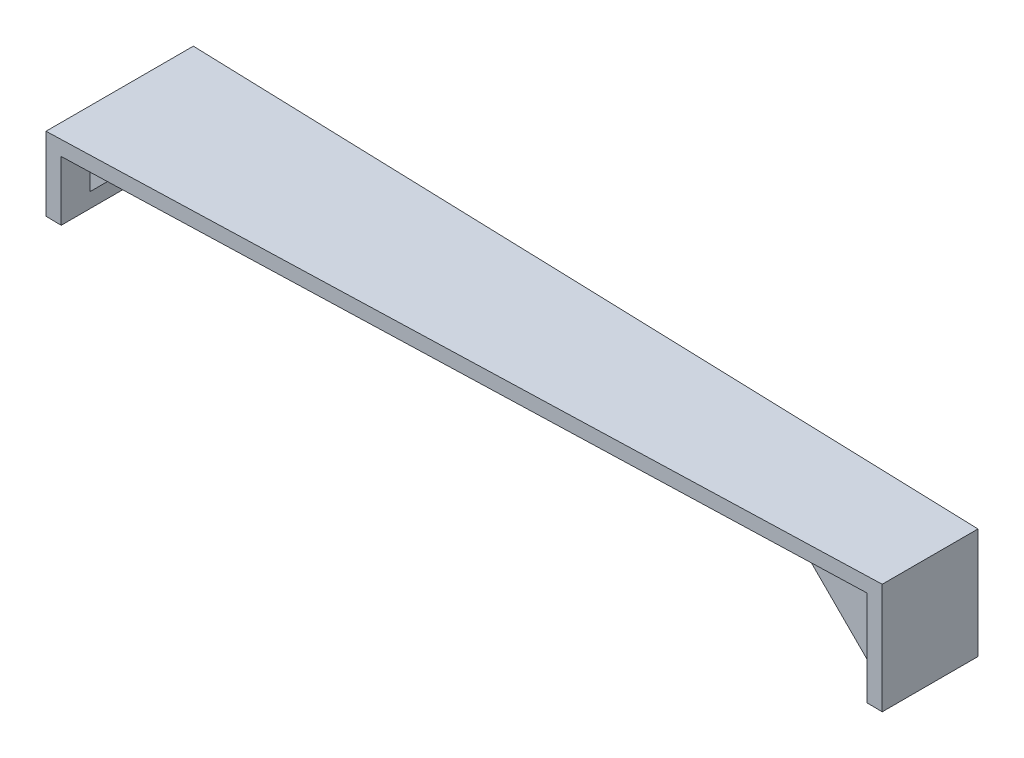
ISO-10303-21;
HEADER;
FILE_DESCRIPTION(('STEP AP214'),'2;1');
FILE_NAME('part.step','',(''),(''),'','','');
FILE_SCHEMA(('AUTOMOTIVE_DESIGN { 1 0 10303 214 1 1 1 1 }'));
ENDSEC;
DATA;
#1=APPLICATION_CONTEXT('core data for automotive mechanical design processes');
#2=APPLICATION_PROTOCOL_DEFINITION('international standard','automotive_design',2000,#1);
#3=PRODUCT_CONTEXT('',#1,'mechanical');
#4=PRODUCT('Part','Part','',(#3));
#5=PRODUCT_RELATED_PRODUCT_CATEGORY('part','',(#4));
#6=PRODUCT_DEFINITION_FORMATION('','',#4);
#7=PRODUCT_DEFINITION_CONTEXT('part definition',#1,'design');
#8=PRODUCT_DEFINITION('design','',#6,#7);
#9=PRODUCT_DEFINITION_SHAPE('','',#8);
#10=(LENGTH_UNIT() NAMED_UNIT(*) SI_UNIT(.MILLI.,.METRE.));
#11=(NAMED_UNIT(*) PLANE_ANGLE_UNIT() SI_UNIT($,.RADIAN.));
#12=(NAMED_UNIT(*) SI_UNIT($,.STERADIAN.) SOLID_ANGLE_UNIT());
#13=UNCERTAINTY_MEASURE_WITH_UNIT(LENGTH_MEASURE(1.E-05),#10,'distance_accuracy_value','');
#14=(GEOMETRIC_REPRESENTATION_CONTEXT(3) GLOBAL_UNCERTAINTY_ASSIGNED_CONTEXT((#13)) GLOBAL_UNIT_ASSIGNED_CONTEXT((#10,
#11,#12)) REPRESENTATION_CONTEXT('',''));
#15=CARTESIAN_POINT('',(0.,0.,0.));
#16=DIRECTION('',(0.,0.,1.));
#17=DIRECTION('',(1.,0.,0.));
#18=AXIS2_PLACEMENT_3D('',#15,#16,#17);
#19=CARTESIAN_POINT('',(0.,-2.,0.));
#20=DIRECTION('',(0.,1.,0.));
#21=DIRECTION('',(0.,0.,1.));
#22=AXIS2_PLACEMENT_3D('',#19,#20,#21);
#23=PLANE('',#22);
#24=DIRECTION('',(0.,0.,-1.));
#25=VECTOR('',#24,1.);
#26=CARTESIAN_POINT('',(53.,-2.,-6.56363636363636));
#27=LINE('',#26,#25);
#28=CARTESIAN_POINT('',(53.,-2.,-6.));
#29=VERTEX_POINT('',#28);
#30=CARTESIAN_POINT('',(53.,-2.,-6.56363636363636));
#31=VERTEX_POINT('',#30);
#32=EDGE_CURVE('E189',#29,#31,#27,.T.);
#33=ORIENTED_EDGE('',*,*,#32,.F.);
#34=DIRECTION('',(-1.,0.,0.));
#35=VECTOR('',#34,1.);
#36=CARTESIAN_POINT('',(53.,-2.,-6.));
#37=LINE('',#36,#35);
#38=CARTESIAN_POINT('',(44.090909090909,-2.,-6.));
#39=VERTEX_POINT('',#38);
#40=EDGE_CURVE('E59',#29,#39,#37,.T.);
#41=ORIENTED_EDGE('',*,*,#40,.T.);
#42=DIRECTION('',(0.,0.,1.));
#43=VECTOR('',#42,1.);
#44=CARTESIAN_POINT('',(44.090909090909,-2.,-6.));
#45=LINE('',#44,#43);
#46=CARTESIAN_POINT('',(44.090909090909,-2.,-4.));
#47=VERTEX_POINT('',#46);
#48=EDGE_CURVE('E63',#39,#47,#45,.T.);
#49=ORIENTED_EDGE('',*,*,#48,.T.);
#50=DIRECTION('',(-1.,0.,0.));
#51=VECTOR('',#50,1.);
#52=CARTESIAN_POINT('',(53.,-2.,-4.));
#53=LINE('',#52,#51);
#54=CARTESIAN_POINT('',(53.,-2.,-4.));
#55=VERTEX_POINT('',#54);
#56=EDGE_CURVE('E192',#55,#47,#53,.T.);
#57=ORIENTED_EDGE('',*,*,#56,.F.);
#58=CARTESIAN_POINT('',(53.,-2.,4.));
#59=VERTEX_POINT('',#58);
#60=EDGE_CURVE('E179',#59,#55,#27,.T.);
#61=ORIENTED_EDGE('',*,*,#60,.F.);
#62=DIRECTION('',(-1.,0.,0.));
#63=VECTOR('',#62,1.);
#64=CARTESIAN_POINT('',(53.,-2.,4.));
#65=LINE('',#64,#63);
#66=CARTESIAN_POINT('',(44.090909090909,-2.,4.));
#67=VERTEX_POINT('',#66);
#68=EDGE_CURVE('E248',#59,#67,#65,.T.);
#69=ORIENTED_EDGE('',*,*,#68,.T.);
#70=DIRECTION('',(0.,0.,-1.));
#71=VECTOR('',#70,1.);
#72=CARTESIAN_POINT('',(44.090909090909,-2.,6.));
#73=LINE('',#72,#71);
#74=CARTESIAN_POINT('',(44.090909090909,-2.,6.));
#75=VERTEX_POINT('',#74);
#76=EDGE_CURVE('E256',#75,#67,#73,.T.);
#77=ORIENTED_EDGE('',*,*,#76,.F.);
#78=DIRECTION('',(-1.,0.,0.));
#79=VECTOR('',#78,1.);
#80=CARTESIAN_POINT('',(53.,-2.,6.));
#81=LINE('',#80,#79);
#82=CARTESIAN_POINT('',(53.,-2.,6.));
#83=VERTEX_POINT('',#82);
#84=EDGE_CURVE('E252',#83,#75,#81,.T.);
#85=ORIENTED_EDGE('',*,*,#84,.F.);
#86=CARTESIAN_POINT('',(53.,-2.,6.56363636363636));
#87=VERTEX_POINT('',#86);
#88=EDGE_CURVE('E188',#87,#83,#27,.T.);
#89=ORIENTED_EDGE('',*,*,#88,.F.);
#90=DIRECTION('',(0.999494185684063,0.,-0.0318020877263111));
#91=VECTOR('',#90,1.);
#92=CARTESIAN_POINT('',(55.,-2.,6.5));
#93=LINE('',#92,#91);
#94=CARTESIAN_POINT('',(-53.,-2.,9.93636363636364));
#95=VERTEX_POINT('',#94);
#96=EDGE_CURVE('E345',#95,#87,#93,.T.);
#97=ORIENTED_EDGE('',*,*,#96,.F.);
#98=DIRECTION('',(0.,0.,1.));
#99=VECTOR('',#98,1.);
#100=CARTESIAN_POINT('',(-53.,-2.,9.93636363636364));
#101=LINE('',#100,#99);
#102=CARTESIAN_POINT('',(-53.,-2.,6.));
#103=VERTEX_POINT('',#102);
#104=EDGE_CURVE('E321',#103,#95,#101,.T.);
#105=ORIENTED_EDGE('',*,*,#104,.F.);
#106=DIRECTION('',(-1.,0.,0.));
#107=VECTOR('',#106,1.);
#108=CARTESIAN_POINT('',(-46.9090909090908,-2.,6.));
#109=LINE('',#108,#107);
#110=CARTESIAN_POINT('',(-46.9090909090908,-2.,6.));
#111=VERTEX_POINT('',#110);
#112=EDGE_CURVE('E279',#111,#103,#109,.T.);
#113=ORIENTED_EDGE('',*,*,#112,.F.);
#114=DIRECTION('',(0.,0.,-1.));
#115=VECTOR('',#114,1.);
#116=CARTESIAN_POINT('',(-46.9090909090908,-2.,6.));
#117=LINE('',#116,#115);
#118=CARTESIAN_POINT('',(-46.9090909090908,-2.,4.));
#119=VERTEX_POINT('',#118);
#120=EDGE_CURVE('E282',#111,#119,#117,.T.);
#121=ORIENTED_EDGE('',*,*,#120,.T.);
#122=DIRECTION('',(-1.,0.,0.));
#123=VECTOR('',#122,1.);
#124=CARTESIAN_POINT('',(-46.9090909090908,-2.,4.));
#125=LINE('',#124,#123);
#126=CARTESIAN_POINT('',(-53.,-2.,4.));
#127=VERTEX_POINT('',#126);
#128=EDGE_CURVE('E276',#119,#127,#125,.T.);
#129=ORIENTED_EDGE('',*,*,#128,.T.);
#130=CARTESIAN_POINT('',(-53.,-2.,-4.));
#131=VERTEX_POINT('',#130);
#132=EDGE_CURVE('E337',#131,#127,#101,.T.);
#133=ORIENTED_EDGE('',*,*,#132,.F.);
#134=DIRECTION('',(-1.,0.,0.));
#135=VECTOR('',#134,1.);
#136=CARTESIAN_POINT('',(-46.9090909090908,-2.,-4.));
#137=LINE('',#136,#135);
#138=CARTESIAN_POINT('',(-46.9090909090908,-2.,-4.));
#139=VERTEX_POINT('',#138);
#140=EDGE_CURVE('E230',#139,#131,#137,.T.);
#141=ORIENTED_EDGE('',*,*,#140,.F.);
#142=DIRECTION('',(0.,0.,1.));
#143=VECTOR('',#142,1.);
#144=CARTESIAN_POINT('',(-46.9090909090908,-2.,-6.));
#145=LINE('',#144,#143);
#146=CARTESIAN_POINT('',(-46.9090909090908,-2.,-6.));
#147=VERTEX_POINT('',#146);
#148=EDGE_CURVE('E239',#147,#139,#145,.T.);
#149=ORIENTED_EDGE('',*,*,#148,.F.);
#150=DIRECTION('',(-1.,0.,0.));
#151=VECTOR('',#150,1.);
#152=CARTESIAN_POINT('',(-46.9090909090908,-2.,-6.));
#153=LINE('',#152,#151);
#154=CARTESIAN_POINT('',(-53.,-2.,-6.));
#155=VERTEX_POINT('',#154);
#156=EDGE_CURVE('E218',#147,#155,#153,.T.);
#157=ORIENTED_EDGE('',*,*,#156,.T.);
#158=CARTESIAN_POINT('',(-52.9999999999999,-2.,-9.93636363636364));
#159=VERTEX_POINT('',#158);
#160=EDGE_CURVE('E332',#159,#155,#101,.T.);
#161=ORIENTED_EDGE('',*,*,#160,.F.);
#162=DIRECTION('',(-0.999494185684063,0.,-0.0318020877263111));
#163=VECTOR('',#162,1.);
#164=CARTESIAN_POINT('',(55.,-2.,-6.5));
#165=LINE('',#164,#163);
#166=EDGE_CURVE('E349',#31,#159,#165,.T.);
#167=ORIENTED_EDGE('',*,*,#166,.F.);
#168=EDGE_LOOP('',(#33,#41,#49,#57,#61,#69,#77,#85,#89,#97,#105,#113,#121,#129,#133,#141,#149,
#157,#161,#167));
#169=FACE_BOUND('',#168,.T.);
#170=ADVANCED_FACE('F41',(#169),#23,.F.);
#171=CARTESIAN_POINT('',(-53.,-50.0997512422418,9.93636363636364));
#172=DIRECTION('',(-1.,0.,0.));
#173=DIRECTION('',(0.,0.,1.));
#174=AXIS2_PLACEMENT_3D('',#171,#172,#173);
#175=PLANE('',#174);
#176=DIRECTION('',(0.,-1.,0.));
#177=VECTOR('',#176,1.);
#178=CARTESIAN_POINT('',(-53.,-2.,-6.));
#179=LINE('',#178,#177);
#180=CARTESIAN_POINT('',(-53.,-8.0909090909091,-6.));
#181=VERTEX_POINT('',#180);
#182=EDGE_CURVE('E214',#155,#181,#179,.T.);
#183=ORIENTED_EDGE('',*,*,#182,.T.);
#184=DIRECTION('',(0.,0.,1.));
#185=VECTOR('',#184,1.);
#186=CARTESIAN_POINT('',(-53.,-8.0909090909091,-6.));
#187=LINE('',#186,#185);
#188=CARTESIAN_POINT('',(-53.,-8.0909090909091,-4.));
#189=VERTEX_POINT('',#188);
#190=EDGE_CURVE('E227',#181,#189,#187,.T.);
#191=ORIENTED_EDGE('',*,*,#190,.T.);
#192=DIRECTION('',(0.,-1.,0.));
#193=VECTOR('',#192,1.);
#194=CARTESIAN_POINT('',(-53.,-2.,-4.));
#195=LINE('',#194,#193);
#196=EDGE_CURVE('E213',#131,#189,#195,.T.);
#197=ORIENTED_EDGE('',*,*,#196,.F.);
#198=ORIENTED_EDGE('',*,*,#132,.T.);
#199=DIRECTION('',(0.,-1.,0.));
#200=VECTOR('',#199,1.);
#201=CARTESIAN_POINT('',(-53.,-2.,4.));
#202=LINE('',#201,#200);
#203=CARTESIAN_POINT('',(-53.,-8.09090909090909,4.));
#204=VERTEX_POINT('',#203);
#205=EDGE_CURVE('E270',#127,#204,#202,.T.);
#206=ORIENTED_EDGE('',*,*,#205,.T.);
#207=DIRECTION('',(0.,0.,-1.));
#208=VECTOR('',#207,1.);
#209=CARTESIAN_POINT('',(-53.,-8.0909090909091,6.));
#210=LINE('',#209,#208);
#211=CARTESIAN_POINT('',(-53.,-8.0909090909091,6.));
#212=VERTEX_POINT('',#211);
#213=EDGE_CURVE('E295',#212,#204,#210,.T.);
#214=ORIENTED_EDGE('',*,*,#213,.F.);
#215=DIRECTION('',(0.,-1.,0.));
#216=VECTOR('',#215,1.);
#217=CARTESIAN_POINT('',(-53.,-2.,6.));
#218=LINE('',#217,#216);
#219=EDGE_CURVE('E271',#103,#212,#218,.T.);
#220=ORIENTED_EDGE('',*,*,#219,.F.);
#221=ORIENTED_EDGE('',*,*,#104,.T.);
#222=DIRECTION('',(0.,1.,0.));
#223=VECTOR('',#222,1.);
#224=CARTESIAN_POINT('',(-53.,-50.0997512422418,9.93636363636364));
#225=LINE('',#224,#223);
#226=CARTESIAN_POINT('',(-53.,-10.0909090909091,9.93636363636364));
#227=VERTEX_POINT('',#226);
#228=EDGE_CURVE('E336',#227,#95,#225,.T.);
#229=ORIENTED_EDGE('',*,*,#228,.F.);
#230=DIRECTION('',(0.,0.,-1.));
#231=VECTOR('',#230,1.);
#232=CARTESIAN_POINT('',(-53.,-10.0909090909091,9.93636363636364));
#233=LINE('',#232,#231);
#234=CARTESIAN_POINT('',(-53.,-10.0909090909091,-9.93636363636363));
#235=VERTEX_POINT('',#234);
#236=EDGE_CURVE('E313',#227,#235,#233,.T.);
#237=ORIENTED_EDGE('',*,*,#236,.T.);
#238=DIRECTION('',(0.,1.,0.));
#239=VECTOR('',#238,1.);
#240=CARTESIAN_POINT('',(-53.,-50.0997512422418,-9.93636363636363));
#241=LINE('',#240,#239);
#242=EDGE_CURVE('E341',#235,#159,#241,.T.);
#243=ORIENTED_EDGE('',*,*,#242,.T.);
#244=ORIENTED_EDGE('',*,*,#160,.T.);
#245=EDGE_LOOP('',(#183,#191,#197,#198,#206,#214,#220,#221,#229,#237,#243,#244));
#246=FACE_BOUND('',#245,.T.);
#247=ADVANCED_FACE('F400',(#246),#175,.F.);
#248=CARTESIAN_POINT('',(-55.,-2.,10.));
#249=DIRECTION('',(-1.,0.,0.));
#250=DIRECTION('',(0.,0.,1.));
#251=AXIS2_PLACEMENT_3D('',#248,#249,#250);
#252=PLANE('',#251);
#253=DIRECTION('',(0.,0.,1.));
#254=VECTOR('',#253,1.);
#255=CARTESIAN_POINT('',(-55.,-10.,-10.));
#256=LINE('',#255,#254);
#257=CARTESIAN_POINT('',(-55.,-10.,-10.));
#258=VERTEX_POINT('',#257);
#259=CARTESIAN_POINT('',(-55.,-10.,10.));
#260=VERTEX_POINT('',#259);
#261=EDGE_CURVE('E298',#258,#260,#256,.T.);
#262=ORIENTED_EDGE('',*,*,#261,.T.);
#263=DIRECTION('',(0.,1.,0.));
#264=VECTOR('',#263,1.);
#265=CARTESIAN_POINT('',(-55.,-2.,10.));
#266=LINE('',#265,#264);
#267=CARTESIAN_POINT('',(-55.,0.,10.));
#268=VERTEX_POINT('',#267);
#269=EDGE_CURVE('E45',#260,#268,#266,.T.);
#270=ORIENTED_EDGE('',*,*,#269,.T.);
#271=DIRECTION('',(0.,0.,1.));
#272=VECTOR('',#271,1.);
#273=CARTESIAN_POINT('',(-55.,0.,10.));
#274=LINE('',#273,#272);
#275=CARTESIAN_POINT('',(-55.,0.,-10.));
#276=VERTEX_POINT('',#275);
#277=EDGE_CURVE('E344',#276,#268,#274,.T.);
#278=ORIENTED_EDGE('',*,*,#277,.F.);
#279=DIRECTION('',(0.,1.,0.));
#280=VECTOR('',#279,1.);
#281=CARTESIAN_POINT('',(-55.,-2.,-10.));
#282=LINE('',#281,#280);
#283=EDGE_CURVE('E12',#258,#276,#282,.T.);
#284=ORIENTED_EDGE('',*,*,#283,.F.);
#285=EDGE_LOOP('',(#262,#270,#278,#284));
#286=FACE_BOUND('',#285,.T.);
#287=ADVANCED_FACE('F43',(#286),#252,.T.);
#288=CARTESIAN_POINT('',(55.,-2.,-6.5));
#289=DIRECTION('',(0.0318020877263111,0.,-0.999494185684063));
#290=DIRECTION('',(-0.999494185684063,0.,-0.0318020877263111));
#291=AXIS2_PLACEMENT_3D('',#288,#289,#290);
#292=PLANE('',#291);
#293=DIRECTION('',(0.998464288673174,-0.0453847403942352,0.0317693182759646));
#294=VECTOR('',#293,1.);
#295=CARTESIAN_POINT('',(54.4109044470535,-14.9732229294115,-6.51874394941193));
#296=LINE('',#295,#294);
#297=EDGE_CURVE('E314',#258,#235,#296,.T.);
#298=ORIENTED_EDGE('',*,*,#297,.F.);
#299=ORIENTED_EDGE('',*,*,#283,.T.);
#300=DIRECTION('',(-0.999494185684063,0.,-0.0318020877263111));
#301=VECTOR('',#300,1.);
#302=CARTESIAN_POINT('',(55.,0.,-6.5));
#303=LINE('',#302,#301);
#304=CARTESIAN_POINT('',(55.,0.,-6.5));
#305=VERTEX_POINT('',#304);
#306=EDGE_CURVE('E350',#305,#276,#303,.T.);
#307=ORIENTED_EDGE('',*,*,#306,.F.);
#308=DIRECTION('',(0.,1.,0.));
#309=VECTOR('',#308,1.);
#310=CARTESIAN_POINT('',(55.,-2.,-6.5));
#311=LINE('',#310,#309);
#312=CARTESIAN_POINT('',(55.,-15.,-6.5));
#313=VERTEX_POINT('',#312);
#314=EDGE_CURVE('E51',#313,#305,#311,.T.);
#315=ORIENTED_EDGE('',*,*,#314,.F.);
#316=CARTESIAN_POINT('',(53.,-14.9090909090909,-6.56363636363636));
#317=VERTEX_POINT('',#316);
#318=EDGE_CURVE('E309',#317,#313,#296,.T.);
#319=ORIENTED_EDGE('',*,*,#318,.F.);
#320=DIRECTION('',(0.,1.,0.));
#321=VECTOR('',#320,1.);
#322=CARTESIAN_POINT('',(53.,-50.0997512422418,-6.56363636363636));
#323=LINE('',#322,#321);
#324=EDGE_CURVE('E326',#317,#31,#323,.T.);
#325=ORIENTED_EDGE('',*,*,#324,.T.);
#326=ORIENTED_EDGE('',*,*,#166,.T.);
#327=ORIENTED_EDGE('',*,*,#242,.F.);
#328=EDGE_LOOP('',(#298,#299,#307,#315,#319,#325,#326,#327));
#329=FACE_BOUND('',#328,.T.);
#330=ADVANCED_FACE('F389',(#329),#292,.T.);
#331=CARTESIAN_POINT('',(55.,-2.,6.5));
#332=DIRECTION('',(1.,0.,0.));
#333=DIRECTION('',(0.,0.,-1.));
#334=AXIS2_PLACEMENT_3D('',#331,#332,#333);
#335=PLANE('',#334);
#336=DIRECTION('',(0.,0.,-1.));
#337=VECTOR('',#336,1.);
#338=CARTESIAN_POINT('',(55.,0.,6.5));
#339=LINE('',#338,#337);
#340=CARTESIAN_POINT('',(55.,0.,6.5));
#341=VERTEX_POINT('',#340);
#342=EDGE_CURVE('E361',#341,#305,#339,.T.);
#343=ORIENTED_EDGE('',*,*,#342,.F.);
#344=DIRECTION('',(0.,1.,0.));
#345=VECTOR('',#344,1.);
#346=CARTESIAN_POINT('',(55.,-2.,6.5));
#347=LINE('',#346,#345);
#348=CARTESIAN_POINT('',(55.,-15.,6.5));
#349=VERTEX_POINT('',#348);
#350=EDGE_CURVE('E369',#349,#341,#347,.T.);
#351=ORIENTED_EDGE('',*,*,#350,.F.);
#352=DIRECTION('',(0.,0.,-1.));
#353=VECTOR('',#352,1.);
#354=CARTESIAN_POINT('',(55.,-15.,-6.5));
#355=LINE('',#354,#353);
#356=EDGE_CURVE('E318',#349,#313,#355,.T.);
#357=ORIENTED_EDGE('',*,*,#356,.T.);
#358=ORIENTED_EDGE('',*,*,#314,.T.);
#359=EDGE_LOOP('',(#343,#351,#357,#358));
#360=FACE_BOUND('',#359,.T.);
#361=ADVANCED_FACE('F443',(#360),#335,.T.);
#362=CARTESIAN_POINT('',(55.,-2.,6.5));
#363=DIRECTION('',(0.0318020877263111,0.,0.999494185684063));
#364=DIRECTION('',(0.999494185684063,0.,-0.0318020877263111));
#365=AXIS2_PLACEMENT_3D('',#362,#363,#364);
#366=PLANE('',#365);
#367=DIRECTION('',(-0.998464288673174,0.0453847403942352,0.0317693182759646));
#368=VECTOR('',#367,1.);
#369=CARTESIAN_POINT('',(54.4109044470535,-14.9732229294115,6.51874394941193));
#370=LINE('',#369,#368);
#371=CARTESIAN_POINT('',(53.,-14.9090909090909,6.56363636363636));
#372=VERTEX_POINT('',#371);
#373=EDGE_CURVE('E306',#349,#372,#370,.T.);
#374=ORIENTED_EDGE('',*,*,#373,.F.);
#375=ORIENTED_EDGE('',*,*,#350,.T.);
#376=DIRECTION('',(0.999494185684063,0.,-0.0318020877263111));
#377=VECTOR('',#376,1.);
#378=CARTESIAN_POINT('',(55.,0.,6.5));
#379=LINE('',#378,#377);
#380=EDGE_CURVE('E357',#268,#341,#379,.T.);
#381=ORIENTED_EDGE('',*,*,#380,.F.);
#382=ORIENTED_EDGE('',*,*,#269,.F.);
#383=EDGE_CURVE('E310',#227,#260,#370,.T.);
#384=ORIENTED_EDGE('',*,*,#383,.F.);
#385=ORIENTED_EDGE('',*,*,#228,.T.);
#386=ORIENTED_EDGE('',*,*,#96,.T.);
#387=DIRECTION('',(0.,1.,0.));
#388=VECTOR('',#387,1.);
#389=CARTESIAN_POINT('',(53.,-50.0997512422418,6.56363636363636));
#390=LINE('',#389,#388);
#391=EDGE_CURVE('E322',#372,#87,#390,.T.);
#392=ORIENTED_EDGE('',*,*,#391,.F.);
#393=EDGE_LOOP('',(#374,#375,#381,#382,#384,#385,#386,#392));
#394=FACE_BOUND('',#393,.T.);
#395=ADVANCED_FACE('F382',(#394),#366,.T.);
#396=CARTESIAN_POINT('',(0.,0.,0.));
#397=DIRECTION('',(0.,1.,0.));
#398=DIRECTION('',(0.,0.,1.));
#399=AXIS2_PLACEMENT_3D('',#396,#397,#398);
#400=PLANE('',#399);
#401=ORIENTED_EDGE('',*,*,#277,.T.);
#402=ORIENTED_EDGE('',*,*,#380,.T.);
#403=ORIENTED_EDGE('',*,*,#342,.T.);
#404=ORIENTED_EDGE('',*,*,#306,.T.);
#405=EDGE_LOOP('',(#401,#402,#403,#404));
#406=FACE_BOUND('',#405,.T.);
#407=ADVANCED_FACE('F384',(#406),#400,.T.);
#408=CARTESIAN_POINT('',(53.,-50.0997512422418,-6.56363636363636));
#409=DIRECTION('',(1.,0.,0.));
#410=DIRECTION('',(0.,0.,-1.));
#411=AXIS2_PLACEMENT_3D('',#408,#409,#410);
#412=PLANE('',#411);
#413=DIRECTION('',(0.,0.,1.));
#414=VECTOR('',#413,1.);
#415=CARTESIAN_POINT('',(53.,-10.9090909090909,-6.));
#416=LINE('',#415,#414);
#417=CARTESIAN_POINT('',(53.,-10.9090909090909,-6.));
#418=VERTEX_POINT('',#417);
#419=CARTESIAN_POINT('',(53.,-10.9090909090909,-4.));
#420=VERTEX_POINT('',#419);
#421=EDGE_CURVE('E207',#418,#420,#416,.T.);
#422=ORIENTED_EDGE('',*,*,#421,.F.);
#423=DIRECTION('',(0.,1.,0.));
#424=VECTOR('',#423,1.);
#425=CARTESIAN_POINT('',(53.,-10.9090909090909,-6.));
#426=LINE('',#425,#424);
#427=EDGE_CURVE('E210',#418,#29,#426,.T.);
#428=ORIENTED_EDGE('',*,*,#427,.T.);
#429=ORIENTED_EDGE('',*,*,#32,.T.);
#430=ORIENTED_EDGE('',*,*,#324,.F.);
#431=DIRECTION('',(0.,0.,1.));
#432=VECTOR('',#431,1.);
#433=CARTESIAN_POINT('',(53.,-14.9090909090909,-6.56363636363636));
#434=LINE('',#433,#432);
#435=EDGE_CURVE('E302',#317,#372,#434,.T.);
#436=ORIENTED_EDGE('',*,*,#435,.T.);
#437=ORIENTED_EDGE('',*,*,#391,.T.);
#438=ORIENTED_EDGE('',*,*,#88,.T.);
#439=DIRECTION('',(0.,1.,0.));
#440=VECTOR('',#439,1.);
#441=CARTESIAN_POINT('',(53.,-10.9090909090909,6.));
#442=LINE('',#441,#440);
#443=CARTESIAN_POINT('',(53.,-10.9090909090909,6.));
#444=VERTEX_POINT('',#443);
#445=EDGE_CURVE('E247',#444,#83,#442,.T.);
#446=ORIENTED_EDGE('',*,*,#445,.F.);
#447=DIRECTION('',(0.,0.,-1.));
#448=VECTOR('',#447,1.);
#449=CARTESIAN_POINT('',(53.,-10.9090909090909,6.));
#450=LINE('',#449,#448);
#451=CARTESIAN_POINT('',(53.,-10.9090909090909,4.));
#452=VERTEX_POINT('',#451);
#453=EDGE_CURVE('E267',#444,#452,#450,.T.);
#454=ORIENTED_EDGE('',*,*,#453,.T.);
#455=DIRECTION('',(0.,1.,0.));
#456=VECTOR('',#455,1.);
#457=CARTESIAN_POINT('',(53.,-10.9090909090909,4.));
#458=LINE('',#457,#456);
#459=EDGE_CURVE('E185',#452,#59,#458,.T.);
#460=ORIENTED_EDGE('',*,*,#459,.T.);
#461=ORIENTED_EDGE('',*,*,#60,.T.);
#462=DIRECTION('',(0.,1.,0.));
#463=VECTOR('',#462,1.);
#464=CARTESIAN_POINT('',(53.,-10.9090909090909,-4.));
#465=LINE('',#464,#463);
#466=EDGE_CURVE('E182',#420,#55,#465,.T.);
#467=ORIENTED_EDGE('',*,*,#466,.F.);
#468=EDGE_LOOP('',(#422,#428,#429,#430,#436,#437,#438,#446,#454,#460,#461,#467));
#469=FACE_BOUND('',#468,.T.);
#470=ADVANCED_FACE('F180',(#469),#412,.F.);
#471=CARTESIAN_POINT('',(-55.,-10.,-10.));
#472=DIRECTION('',(0.04540766091865,0.9989685402103,0.));
#473=DIRECTION('',(-0.9989685402103,0.04540766091865,0.));
#474=AXIS2_PLACEMENT_3D('',#471,#472,#473);
#475=PLANE('',#474);
#476=ORIENTED_EDGE('',*,*,#318,.T.);
#477=ORIENTED_EDGE('',*,*,#356,.F.);
#478=ORIENTED_EDGE('',*,*,#373,.T.);
#479=ORIENTED_EDGE('',*,*,#435,.F.);
#480=EDGE_LOOP('',(#476,#477,#478,#479));
#481=FACE_BOUND('',#480,.T.);
#482=ADVANCED_FACE('F464',(#481),#475,.F.);
#483=ORIENTED_EDGE('',*,*,#297,.T.);
#484=ORIENTED_EDGE('',*,*,#236,.F.);
#485=ORIENTED_EDGE('',*,*,#383,.T.);
#486=ORIENTED_EDGE('',*,*,#261,.F.);
#487=EDGE_LOOP('',(#483,#484,#485,#486));
#488=FACE_BOUND('',#487,.T.);
#489=ADVANCED_FACE('F396',(#488),#475,.F.);
#490=CARTESIAN_POINT('',(-53.,-8.0909090909091,6.));
#491=DIRECTION('',(-0.707106781186544,0.707106781186551,0.));
#492=DIRECTION('',(-0.707106781186551,-0.707106781186544,0.));
#493=AXIS2_PLACEMENT_3D('',#490,#491,#492);
#494=PLANE('',#493);
#495=DIRECTION('',(0.707106781186551,0.707106781186544,0.));
#496=VECTOR('',#495,1.);
#497=CARTESIAN_POINT('',(-53.,-8.0909090909091,4.));
#498=LINE('',#497,#496);
#499=EDGE_CURVE('E286',#204,#119,#498,.T.);
#500=ORIENTED_EDGE('',*,*,#499,.T.);
#501=ORIENTED_EDGE('',*,*,#120,.F.);
#502=DIRECTION('',(0.707106781186551,0.707106781186544,0.));
#503=VECTOR('',#502,1.);
#504=CARTESIAN_POINT('',(-53.,-8.0909090909091,6.));
#505=LINE('',#504,#503);
#506=EDGE_CURVE('E275',#212,#111,#505,.T.);
#507=ORIENTED_EDGE('',*,*,#506,.F.);
#508=ORIENTED_EDGE('',*,*,#213,.T.);
#509=EDGE_LOOP('',(#500,#501,#507,#508));
#510=FACE_BOUND('',#509,.T.);
#511=ADVANCED_FACE('F417',(#510),#494,.F.);
#512=CARTESIAN_POINT('',(0.,0.,6.));
#513=DIRECTION('',(0.,0.,-1.));
#514=DIRECTION('',(-1.,0.,0.));
#515=AXIS2_PLACEMENT_3D('',#512,#513,#514);
#516=PLANE('',#515);
#517=ORIENTED_EDGE('',*,*,#219,.T.);
#518=ORIENTED_EDGE('',*,*,#506,.T.);
#519=ORIENTED_EDGE('',*,*,#112,.T.);
#520=EDGE_LOOP('',(#517,#518,#519));
#521=FACE_BOUND('',#520,.T.);
#522=ADVANCED_FACE('F419',(#521),#516,.F.);
#523=CARTESIAN_POINT('',(0.,0.,4.));
#524=DIRECTION('',(0.,0.,-1.));
#525=DIRECTION('',(-1.,0.,0.));
#526=AXIS2_PLACEMENT_3D('',#523,#524,#525);
#527=PLANE('',#526);
#528=ORIENTED_EDGE('',*,*,#205,.F.);
#529=ORIENTED_EDGE('',*,*,#128,.F.);
#530=ORIENTED_EDGE('',*,*,#499,.F.);
#531=EDGE_LOOP('',(#528,#529,#530));
#532=FACE_BOUND('',#531,.T.);
#533=ADVANCED_FACE('F414',(#532),#527,.T.);
#534=CARTESIAN_POINT('',(44.090909090909,-2.,6.));
#535=DIRECTION('',(0.707106781186544,0.707106781186552,0.));
#536=DIRECTION('',(-0.707106781186552,0.707106781186544,0.));
#537=AXIS2_PLACEMENT_3D('',#534,#535,#536);
#538=PLANE('',#537);
#539=DIRECTION('',(0.707106781186552,-0.707106781186544,0.));
#540=VECTOR('',#539,1.);
#541=CARTESIAN_POINT('',(44.090909090909,-2.,4.));
#542=LINE('',#541,#540);
#543=EDGE_CURVE('E242',#67,#452,#542,.T.);
#544=ORIENTED_EDGE('',*,*,#543,.T.);
#545=ORIENTED_EDGE('',*,*,#453,.F.);
#546=DIRECTION('',(0.707106781186552,-0.707106781186544,0.));
#547=VECTOR('',#546,1.);
#548=CARTESIAN_POINT('',(44.090909090909,-2.,6.));
#549=LINE('',#548,#547);
#550=EDGE_CURVE('E243',#75,#444,#549,.T.);
#551=ORIENTED_EDGE('',*,*,#550,.F.);
#552=ORIENTED_EDGE('',*,*,#76,.T.);
#553=EDGE_LOOP('',(#544,#545,#551,#552));
#554=FACE_BOUND('',#553,.T.);
#555=ADVANCED_FACE('F426',(#554),#538,.F.);
#556=CARTESIAN_POINT('',(0.,0.,6.));
#557=DIRECTION('',(0.,0.,1.));
#558=DIRECTION('',(1.,0.,0.));
#559=AXIS2_PLACEMENT_3D('',#556,#557,#558);
#560=PLANE('',#559);
#561=ORIENTED_EDGE('',*,*,#550,.T.);
#562=ORIENTED_EDGE('',*,*,#445,.T.);
#563=ORIENTED_EDGE('',*,*,#84,.T.);
#564=EDGE_LOOP('',(#561,#562,#563));
#565=FACE_BOUND('',#564,.T.);
#566=ADVANCED_FACE('F512',(#565),#560,.T.);
#567=CARTESIAN_POINT('',(0.,0.,4.));
#568=DIRECTION('',(0.,0.,1.));
#569=DIRECTION('',(1.,0.,0.));
#570=AXIS2_PLACEMENT_3D('',#567,#568,#569);
#571=PLANE('',#570);
#572=ORIENTED_EDGE('',*,*,#543,.F.);
#573=ORIENTED_EDGE('',*,*,#68,.F.);
#574=ORIENTED_EDGE('',*,*,#459,.F.);
#575=EDGE_LOOP('',(#572,#573,#574));
#576=FACE_BOUND('',#575,.T.);
#577=ADVANCED_FACE('F520',(#576),#571,.F.);
#578=CARTESIAN_POINT('',(-53.,-8.0909090909091,-6.));
#579=DIRECTION('',(0.707106781186544,-0.707106781186551,0.));
#580=DIRECTION('',(0.707106781186551,0.707106781186544,0.));
#581=AXIS2_PLACEMENT_3D('',#578,#579,#580);
#582=PLANE('',#581);
#583=DIRECTION('',(0.707106781186551,0.707106781186544,0.));
#584=VECTOR('',#583,1.);
#585=CARTESIAN_POINT('',(-53.,-8.0909090909091,-4.));
#586=LINE('',#585,#584);
#587=EDGE_CURVE('E219',#189,#139,#586,.T.);
#588=ORIENTED_EDGE('',*,*,#587,.F.);
#589=ORIENTED_EDGE('',*,*,#190,.F.);
#590=DIRECTION('',(0.707106781186551,0.707106781186544,0.));
#591=VECTOR('',#590,1.);
#592=CARTESIAN_POINT('',(-53.,-8.0909090909091,-6.));
#593=LINE('',#592,#591);
#594=EDGE_CURVE('E223',#181,#147,#593,.T.);
#595=ORIENTED_EDGE('',*,*,#594,.T.);
#596=ORIENTED_EDGE('',*,*,#148,.T.);
#597=EDGE_LOOP('',(#588,#589,#595,#596));
#598=FACE_BOUND('',#597,.T.);
#599=ADVANCED_FACE('F528',(#598),#582,.T.);
#600=CARTESIAN_POINT('',(0.,0.,-6.));
#601=DIRECTION('',(0.,0.,1.));
#602=DIRECTION('',(-1.,0.,0.));
#603=AXIS2_PLACEMENT_3D('',#600,#601,#602);
#604=PLANE('',#603);
#605=ORIENTED_EDGE('',*,*,#182,.F.);
#606=ORIENTED_EDGE('',*,*,#156,.F.);
#607=ORIENTED_EDGE('',*,*,#594,.F.);
#608=EDGE_LOOP('',(#605,#606,#607));
#609=FACE_BOUND('',#608,.T.);
#610=ADVANCED_FACE('F537',(#609),#604,.F.);
#611=CARTESIAN_POINT('',(0.,0.,-4.));
#612=DIRECTION('',(0.,0.,1.));
#613=DIRECTION('',(-1.,0.,0.));
#614=AXIS2_PLACEMENT_3D('',#611,#612,#613);
#615=PLANE('',#614);
#616=ORIENTED_EDGE('',*,*,#196,.T.);
#617=ORIENTED_EDGE('',*,*,#587,.T.);
#618=ORIENTED_EDGE('',*,*,#140,.T.);
#619=EDGE_LOOP('',(#616,#617,#618));
#620=FACE_BOUND('',#619,.T.);
#621=ADVANCED_FACE('F544',(#620),#615,.T.);
#622=CARTESIAN_POINT('',(44.090909090909,-2.,-6.));
#623=DIRECTION('',(-0.707106781186544,-0.707106781186552,0.));
#624=DIRECTION('',(0.707106781186552,-0.707106781186544,0.));
#625=AXIS2_PLACEMENT_3D('',#622,#623,#624);
#626=PLANE('',#625);
#627=DIRECTION('',(0.707106781186552,-0.707106781186544,0.));
#628=VECTOR('',#627,1.);
#629=CARTESIAN_POINT('',(44.090909090909,-2.,-4.));
#630=LINE('',#629,#628);
#631=EDGE_CURVE('E196',#47,#420,#630,.T.);
#632=ORIENTED_EDGE('',*,*,#631,.F.);
#633=ORIENTED_EDGE('',*,*,#48,.F.);
#634=DIRECTION('',(0.707106781186552,-0.707106781186544,0.));
#635=VECTOR('',#634,1.);
#636=CARTESIAN_POINT('',(44.090909090909,-2.,-6.));
#637=LINE('',#636,#635);
#638=EDGE_CURVE('E200',#39,#418,#637,.T.);
#639=ORIENTED_EDGE('',*,*,#638,.T.);
#640=ORIENTED_EDGE('',*,*,#421,.T.);
#641=EDGE_LOOP('',(#632,#633,#639,#640));
#642=FACE_BOUND('',#641,.T.);
#643=ADVANCED_FACE('F552',(#642),#626,.T.);
#644=CARTESIAN_POINT('',(0.,0.,-6.));
#645=DIRECTION('',(0.,0.,-1.));
#646=DIRECTION('',(1.,0.,0.));
#647=AXIS2_PLACEMENT_3D('',#644,#645,#646);
#648=PLANE('',#647);
#649=ORIENTED_EDGE('',*,*,#638,.F.);
#650=ORIENTED_EDGE('',*,*,#40,.F.);
#651=ORIENTED_EDGE('',*,*,#427,.F.);
#652=EDGE_LOOP('',(#649,#650,#651));
#653=FACE_BOUND('',#652,.T.);
#654=ADVANCED_FACE('F560',(#653),#648,.T.);
#655=CARTESIAN_POINT('',(0.,0.,-4.));
#656=DIRECTION('',(0.,0.,-1.));
#657=DIRECTION('',(1.,0.,0.));
#658=AXIS2_PLACEMENT_3D('',#655,#656,#657);
#659=PLANE('',#658);
#660=ORIENTED_EDGE('',*,*,#631,.T.);
#661=ORIENTED_EDGE('',*,*,#466,.T.);
#662=ORIENTED_EDGE('',*,*,#56,.T.);
#663=EDGE_LOOP('',(#660,#661,#662));
#664=FACE_BOUND('',#663,.T.);
#665=ADVANCED_FACE('F198',(#664),#659,.F.);
#666=CLOSED_SHELL('',(#170,#247,#287,#330,#361,#395,#407,#470,#482,#489,#511,#522,#533,#555,
#566,#577,#599,#610,#621,#643,#654,#665));
#667=MANIFOLD_SOLID_BREP('B2',#666);
#668=ADVANCED_BREP_SHAPE_REPRESENTATION('',(#18,#667),#14);
#669=SHAPE_DEFINITION_REPRESENTATION(#9,#668);
ENDSEC;
END-ISO-10303-21;
